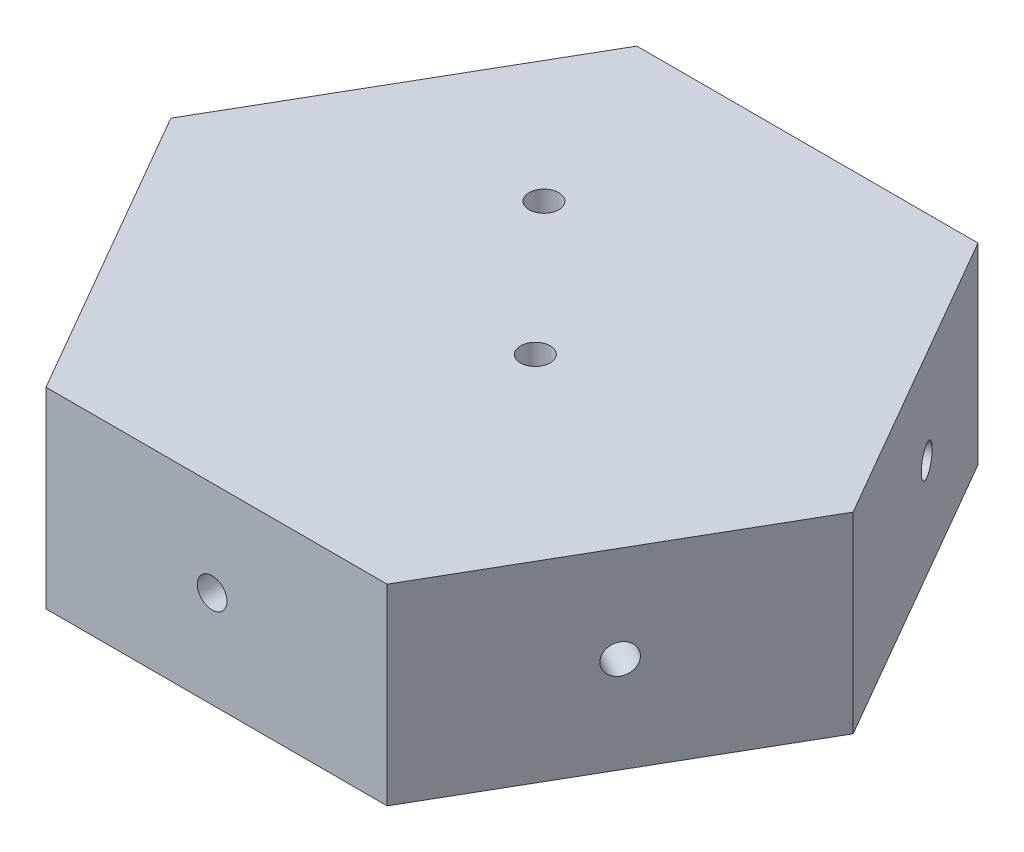
ISO-10303-21;
HEADER;
FILE_DESCRIPTION(('STEP AP214'),'2;1');
FILE_NAME('part.step','',(''),(''),'','','');
FILE_SCHEMA(('AUTOMOTIVE_DESIGN { 1 0 10303 214 1 1 1 1 }'));
ENDSEC;
DATA;
#1=APPLICATION_CONTEXT('core data for automotive mechanical design processes');
#2=APPLICATION_PROTOCOL_DEFINITION('international standard','automotive_design',2000,#1);
#3=PRODUCT_CONTEXT('',#1,'mechanical');
#4=PRODUCT('Part','Part','',(#3));
#5=PRODUCT_RELATED_PRODUCT_CATEGORY('part','',(#4));
#6=PRODUCT_DEFINITION_FORMATION('','',#4);
#7=PRODUCT_DEFINITION_CONTEXT('part definition',#1,'design');
#8=PRODUCT_DEFINITION('design','',#6,#7);
#9=PRODUCT_DEFINITION_SHAPE('','',#8);
#10=(LENGTH_UNIT() NAMED_UNIT(*) SI_UNIT(.MILLI.,.METRE.));
#11=(NAMED_UNIT(*) PLANE_ANGLE_UNIT() SI_UNIT($,.RADIAN.));
#12=(NAMED_UNIT(*) SI_UNIT($,.STERADIAN.) SOLID_ANGLE_UNIT());
#13=UNCERTAINTY_MEASURE_WITH_UNIT(LENGTH_MEASURE(1.E-05),#10,'distance_accuracy_value','');
#14=(GEOMETRIC_REPRESENTATION_CONTEXT(3) GLOBAL_UNCERTAINTY_ASSIGNED_CONTEXT((#13)) GLOBAL_UNIT_ASSIGNED_CONTEXT((#10,
#11,#12)) REPRESENTATION_CONTEXT('',''));
#15=CARTESIAN_POINT('',(0.,0.,0.));
#16=DIRECTION('',(0.,0.,1.));
#17=DIRECTION('',(1.,0.,0.));
#18=AXIS2_PLACEMENT_3D('',#15,#16,#17);
#19=CARTESIAN_POINT('',(29.3293936748329,16.51,50.8));
#20=DIRECTION('',(-0.866025403784438,0.,-0.500000000000001));
#21=DIRECTION('',(-0.500000000000001,0.,0.866025403784438));
#22=AXIS2_PLACEMENT_3D('',#19,#20,#21);
#23=PLANE('',#22);
#24=CARTESIAN_POINT('',(43.9940905122495,0.,25.4));
#25=DIRECTION('',(0.866025403784438,0.,0.500000000000001));
#26=DIRECTION('',(0.500000000000001,0.,-0.866025403784438));
#27=AXIS2_PLACEMENT_3D('',#24,#25,#26);
#28=CIRCLE('',#27,2.55269999999999);
#29=CARTESIAN_POINT('',(45.2704405122495,0.,23.1892969517595));
#30=VERTEX_POINT('',#29);
#31=EDGE_CURVE('E171',#30,#30,#28,.T.);
#32=ORIENTED_EDGE('',*,*,#31,.F.);
#33=EDGE_LOOP('',(#32));
#34=FACE_BOUND('',#33,.T.);
#35=DIRECTION('',(0.500000000000001,0.,-0.866025403784438));
#36=VECTOR('',#35,1.);
#37=CARTESIAN_POINT('',(29.3293936748329,-16.51,50.8));
#38=LINE('',#37,#36);
#39=CARTESIAN_POINT('',(29.3293936748329,-16.51,50.8));
#40=VERTEX_POINT('',#39);
#41=CARTESIAN_POINT('',(58.658787349666,-16.51,0.));
#42=VERTEX_POINT('',#41);
#43=EDGE_CURVE('E124',#40,#42,#38,.T.);
#44=ORIENTED_EDGE('',*,*,#43,.T.);
#45=DIRECTION('',(0.,-1.,0.));
#46=VECTOR('',#45,1.);
#47=CARTESIAN_POINT('',(58.658787349666,16.51,0.));
#48=LINE('',#47,#46);
#49=CARTESIAN_POINT('',(58.658787349666,16.51,0.));
#50=VERTEX_POINT('',#49);
#51=EDGE_CURVE('E11',#50,#42,#48,.T.);
#52=ORIENTED_EDGE('',*,*,#51,.F.);
#53=DIRECTION('',(0.500000000000001,0.,-0.866025403784438));
#54=VECTOR('',#53,1.);
#55=CARTESIAN_POINT('',(29.3293936748329,16.51,50.8));
#56=LINE('',#55,#54);
#57=CARTESIAN_POINT('',(29.3293936748329,16.51,50.8));
#58=VERTEX_POINT('',#57);
#59=EDGE_CURVE('E135',#58,#50,#56,.T.);
#60=ORIENTED_EDGE('',*,*,#59,.F.);
#61=DIRECTION('',(0.,-1.,0.));
#62=VECTOR('',#61,1.);
#63=CARTESIAN_POINT('',(29.3293936748329,16.51,50.8));
#64=LINE('',#63,#62);
#65=EDGE_CURVE('E120',#58,#40,#64,.T.);
#66=ORIENTED_EDGE('',*,*,#65,.T.);
#67=EDGE_LOOP('',(#44,#52,#60,#66));
#68=FACE_BOUND('',#67,.T.);
#69=ADVANCED_FACE('F37',(#34,#68),#23,.F.);
#70=CARTESIAN_POINT('',(58.658787349666,16.51,0.));
#71=DIRECTION('',(-0.866025403784439,0.,0.5));
#72=DIRECTION('',(0.5,0.,0.866025403784439));
#73=AXIS2_PLACEMENT_3D('',#70,#71,#72);
#74=PLANE('',#73);
#75=CARTESIAN_POINT('',(41.3695186698174,0.562395415575524,-29.9458917792071));
#76=DIRECTION('',(0.866025403784439,0.,-0.5));
#77=DIRECTION('',(-0.5,0.,-0.866025403784439));
#78=AXIS2_PLACEMENT_3D('',#75,#76,#77);
#79=CIRCLE('',#78,2.55269999999999);
#80=CARTESIAN_POINT('',(40.0931686698174,0.562395415575524,-32.1565948274477));
#81=VERTEX_POINT('',#80);
#82=EDGE_CURVE('E180',#81,#81,#79,.T.);
#83=ORIENTED_EDGE('',*,*,#82,.F.);
#84=EDGE_LOOP('',(#83));
#85=FACE_BOUND('',#84,.T.);
#86=DIRECTION('',(-0.5,0.,-0.866025403784439));
#87=VECTOR('',#86,1.);
#88=CARTESIAN_POINT('',(58.658787349666,-16.51,0.));
#89=LINE('',#88,#87);
#90=CARTESIAN_POINT('',(29.329393674833,-16.51,-50.8));
#91=VERTEX_POINT('',#90);
#92=EDGE_CURVE('E127',#42,#91,#89,.T.);
#93=ORIENTED_EDGE('',*,*,#92,.T.);
#94=DIRECTION('',(0.,-1.,0.));
#95=VECTOR('',#94,1.);
#96=CARTESIAN_POINT('',(29.329393674833,16.51,-50.8));
#97=LINE('',#96,#95);
#98=CARTESIAN_POINT('',(29.329393674833,16.51,-50.8));
#99=VERTEX_POINT('',#98);
#100=EDGE_CURVE('E45',#99,#91,#97,.T.);
#101=ORIENTED_EDGE('',*,*,#100,.F.);
#102=DIRECTION('',(-0.5,0.,-0.866025403784439));
#103=VECTOR('',#102,1.);
#104=CARTESIAN_POINT('',(58.658787349666,16.51,0.));
#105=LINE('',#104,#103);
#106=EDGE_CURVE('E91',#50,#99,#105,.T.);
#107=ORIENTED_EDGE('',*,*,#106,.F.);
#108=ORIENTED_EDGE('',*,*,#51,.T.);
#109=EDGE_LOOP('',(#93,#101,#107,#108));
#110=FACE_BOUND('',#109,.T.);
#111=ADVANCED_FACE('F163',(#85,#110),#74,.F.);
#112=CARTESIAN_POINT('',(29.329393674833,16.51,-50.8));
#113=DIRECTION('',(0.,0.,1.));
#114=DIRECTION('',(1.,0.,0.));
#115=AXIS2_PLACEMENT_3D('',#112,#113,#114);
#116=PLANE('',#115);
#117=CARTESIAN_POINT('',(3.49006176912397,-2.91662730810145,-50.8));
#118=DIRECTION('',(0.,0.,-1.));
#119=DIRECTION('',(-1.,0.,0.));
#120=AXIS2_PLACEMENT_3D('',#117,#118,#119);
#121=CIRCLE('',#120,2.55269999999999);
#122=CARTESIAN_POINT('',(0.937361769123982,-2.91662730810145,-50.8));
#123=VERTEX_POINT('',#122);
#124=EDGE_CURVE('E201',#123,#123,#121,.T.);
#125=ORIENTED_EDGE('',*,*,#124,.F.);
#126=EDGE_LOOP('',(#125));
#127=FACE_BOUND('',#126,.T.);
#128=DIRECTION('',(-1.,0.,0.));
#129=VECTOR('',#128,1.);
#130=CARTESIAN_POINT('',(29.329393674833,-16.51,-50.8));
#131=LINE('',#130,#129);
#132=CARTESIAN_POINT('',(-29.329393674833,-16.51,-50.8));
#133=VERTEX_POINT('',#132);
#134=EDGE_CURVE('E130',#91,#133,#131,.T.);
#135=ORIENTED_EDGE('',*,*,#134,.T.);
#136=DIRECTION('',(0.,-1.,0.));
#137=VECTOR('',#136,1.);
#138=CARTESIAN_POINT('',(-29.329393674833,16.51,-50.8));
#139=LINE('',#138,#137);
#140=CARTESIAN_POINT('',(-29.329393674833,16.51,-50.8));
#141=VERTEX_POINT('',#140);
#142=EDGE_CURVE('E115',#141,#133,#139,.T.);
#143=ORIENTED_EDGE('',*,*,#142,.F.);
#144=DIRECTION('',(-1.,0.,0.));
#145=VECTOR('',#144,1.);
#146=CARTESIAN_POINT('',(29.329393674833,16.51,-50.8));
#147=LINE('',#146,#145);
#148=EDGE_CURVE('E106',#99,#141,#147,.T.);
#149=ORIENTED_EDGE('',*,*,#148,.F.);
#150=ORIENTED_EDGE('',*,*,#100,.T.);
#151=EDGE_LOOP('',(#135,#143,#149,#150));
#152=FACE_BOUND('',#151,.T.);
#153=ADVANCED_FACE('F141',(#127,#152),#116,.F.);
#154=CARTESIAN_POINT('',(-29.329393674833,16.51,-50.8));
#155=DIRECTION('',(0.866025403784439,0.,0.5));
#156=DIRECTION('',(0.5,0.,-0.866025403784439));
#157=AXIS2_PLACEMENT_3D('',#154,#155,#156);
#158=PLANE('',#157);
#159=CARTESIAN_POINT('',(-48.0314023050068,-4.74515927134678,-18.4071708489473));
#160=DIRECTION('',(-0.866025403784439,0.,-0.5));
#161=DIRECTION('',(-0.5,0.,0.866025403784439));
#162=AXIS2_PLACEMENT_3D('',#159,#160,#161);
#163=CIRCLE('',#162,2.55269999999999);
#164=CARTESIAN_POINT('',(-49.3077523050068,-4.74515927134678,-16.1964678007068));
#165=VERTEX_POINT('',#164);
#166=EDGE_CURVE('E195',#165,#165,#163,.T.);
#167=ORIENTED_EDGE('',*,*,#166,.F.);
#168=EDGE_LOOP('',(#167));
#169=FACE_BOUND('',#168,.T.);
#170=DIRECTION('',(-0.5,0.,0.866025403784439));
#171=VECTOR('',#170,1.);
#172=CARTESIAN_POINT('',(-29.329393674833,-16.51,-50.8));
#173=LINE('',#172,#171);
#174=CARTESIAN_POINT('',(-58.658787349666,-16.51,0.));
#175=VERTEX_POINT('',#174);
#176=EDGE_CURVE('E114',#133,#175,#173,.T.);
#177=ORIENTED_EDGE('',*,*,#176,.T.);
#178=DIRECTION('',(0.,-1.,0.));
#179=VECTOR('',#178,1.);
#180=CARTESIAN_POINT('',(-58.658787349666,16.51,0.));
#181=LINE('',#180,#179);
#182=CARTESIAN_POINT('',(-58.658787349666,16.51,0.));
#183=VERTEX_POINT('',#182);
#184=EDGE_CURVE('E111',#183,#175,#181,.T.);
#185=ORIENTED_EDGE('',*,*,#184,.F.);
#186=DIRECTION('',(-0.5,0.,0.866025403784439));
#187=VECTOR('',#186,1.);
#188=CARTESIAN_POINT('',(-29.329393674833,16.51,-50.8));
#189=LINE('',#188,#187);
#190=EDGE_CURVE('E100',#141,#183,#189,.T.);
#191=ORIENTED_EDGE('',*,*,#190,.F.);
#192=ORIENTED_EDGE('',*,*,#142,.T.);
#193=EDGE_LOOP('',(#177,#185,#191,#192));
#194=FACE_BOUND('',#193,.T.);
#195=ADVANCED_FACE('F112',(#169,#194),#158,.F.);
#196=CARTESIAN_POINT('',(-58.658787349666,16.51,0.));
#197=DIRECTION('',(0.866025403784439,0.,-0.5));
#198=DIRECTION('',(-0.5,0.,-0.866025403784439));
#199=AXIS2_PLACEMENT_3D('',#196,#197,#198);
#200=PLANE('',#199);
#201=CARTESIAN_POINT('',(-38.1907027159222,-1.73066085051785,35.4517625192641));
#202=DIRECTION('',(-0.866025403784439,0.,0.5));
#203=DIRECTION('',(0.5,0.,0.866025403784439));
#204=AXIS2_PLACEMENT_3D('',#201,#202,#203);
#205=CIRCLE('',#204,2.55269999999999);
#206=CARTESIAN_POINT('',(-36.9143527159222,-1.73066085051785,37.6624655675046));
#207=VERTEX_POINT('',#206);
#208=EDGE_CURVE('E189',#207,#207,#205,.T.);
#209=ORIENTED_EDGE('',*,*,#208,.F.);
#210=EDGE_LOOP('',(#209));
#211=FACE_BOUND('',#210,.T.);
#212=DIRECTION('',(0.5,0.,0.866025403784439));
#213=VECTOR('',#212,1.);
#214=CARTESIAN_POINT('',(-58.658787349666,-16.51,0.));
#215=LINE('',#214,#213);
#216=CARTESIAN_POINT('',(-29.329393674833,-16.51,50.8));
#217=VERTEX_POINT('',#216);
#218=EDGE_CURVE('E77',#175,#217,#215,.T.);
#219=ORIENTED_EDGE('',*,*,#218,.T.);
#220=DIRECTION('',(0.,-1.,0.));
#221=VECTOR('',#220,1.);
#222=CARTESIAN_POINT('',(-29.329393674833,16.51,50.8));
#223=LINE('',#222,#221);
#224=CARTESIAN_POINT('',(-29.329393674833,16.51,50.8));
#225=VERTEX_POINT('',#224);
#226=EDGE_CURVE('E116',#225,#217,#223,.T.);
#227=ORIENTED_EDGE('',*,*,#226,.F.);
#228=DIRECTION('',(0.5,0.,0.866025403784439));
#229=VECTOR('',#228,1.);
#230=CARTESIAN_POINT('',(-58.658787349666,16.51,0.));
#231=LINE('',#230,#229);
#232=EDGE_CURVE('E104',#183,#225,#231,.T.);
#233=ORIENTED_EDGE('',*,*,#232,.F.);
#234=ORIENTED_EDGE('',*,*,#184,.T.);
#235=EDGE_LOOP('',(#219,#227,#233,#234));
#236=FACE_BOUND('',#235,.T.);
#237=ADVANCED_FACE('F118',(#211,#236),#200,.F.);
#238=CARTESIAN_POINT('',(-29.329393674833,16.51,50.8));
#239=DIRECTION('',(0.,0.,-1.));
#240=DIRECTION('',(-1.,0.,0.));
#241=AXIS2_PLACEMENT_3D('',#238,#239,#240);
#242=PLANE('',#241);
#243=CARTESIAN_POINT('',(-0.767217268227669,0.17198146021207,50.8));
#244=DIRECTION('',(0.,0.,1.));
#245=DIRECTION('',(1.,0.,0.));
#246=AXIS2_PLACEMENT_3D('',#243,#244,#245);
#247=CIRCLE('',#246,2.55269999999999);
#248=CARTESIAN_POINT('',(1.78548273177232,0.17198146021207,50.8));
#249=VERTEX_POINT('',#248);
#250=EDGE_CURVE('E177',#249,#249,#247,.T.);
#251=ORIENTED_EDGE('',*,*,#250,.F.);
#252=EDGE_LOOP('',(#251));
#253=FACE_BOUND('',#252,.T.);
#254=DIRECTION('',(1.,0.,0.));
#255=VECTOR('',#254,1.);
#256=CARTESIAN_POINT('',(-29.329393674833,-16.51,50.8));
#257=LINE('',#256,#255);
#258=EDGE_CURVE('E83',#217,#40,#257,.T.);
#259=ORIENTED_EDGE('',*,*,#258,.T.);
#260=ORIENTED_EDGE('',*,*,#65,.F.);
#261=DIRECTION('',(1.,0.,0.));
#262=VECTOR('',#261,1.);
#263=CARTESIAN_POINT('',(-29.329393674833,16.51,50.8));
#264=LINE('',#263,#262);
#265=EDGE_CURVE('E53',#225,#58,#264,.T.);
#266=ORIENTED_EDGE('',*,*,#265,.F.);
#267=ORIENTED_EDGE('',*,*,#226,.T.);
#268=EDGE_LOOP('',(#259,#260,#266,#267));
#269=FACE_BOUND('',#268,.T.);
#270=ADVANCED_FACE('F148',(#253,#269),#242,.F.);
#271=CARTESIAN_POINT('',(0.,16.51,0.));
#272=DIRECTION('',(0.,1.,0.));
#273=DIRECTION('',(0.,0.,1.));
#274=AXIS2_PLACEMENT_3D('',#271,#272,#273);
#275=PLANE('',#274);
#276=CARTESIAN_POINT('',(-14.2251630332835,16.51,-19.7173805260744));
#277=DIRECTION('',(0.,1.,0.));
#278=DIRECTION('',(0.,0.,1.));
#279=AXIS2_PLACEMENT_3D('',#276,#277,#278);
#280=CIRCLE('',#279,2.55269999999999);
#281=CARTESIAN_POINT('',(-14.2251630332835,16.51,-17.1646805260744));
#282=VERTEX_POINT('',#281);
#283=EDGE_CURVE('E425',#282,#282,#280,.T.);
#284=ORIENTED_EDGE('',*,*,#283,.F.);
#285=EDGE_LOOP('',(#284));
#286=FACE_BOUND('',#285,.T.);
#287=CARTESIAN_POINT('',(7.85448984860959,16.51,3.83965717438231));
#288=DIRECTION('',(0.,1.,0.));
#289=DIRECTION('',(0.,0.,1.));
#290=AXIS2_PLACEMENT_3D('',#287,#288,#289);
#291=CIRCLE('',#290,2.55269999999999);
#292=CARTESIAN_POINT('',(7.85448984860959,16.51,6.3923571743823));
#293=VERTEX_POINT('',#292);
#294=EDGE_CURVE('E207',#293,#293,#291,.T.);
#295=ORIENTED_EDGE('',*,*,#294,.F.);
#296=EDGE_LOOP('',(#295));
#297=FACE_BOUND('',#296,.T.);
#298=ORIENTED_EDGE('',*,*,#59,.T.);
#299=ORIENTED_EDGE('',*,*,#106,.T.);
#300=ORIENTED_EDGE('',*,*,#148,.T.);
#301=ORIENTED_EDGE('',*,*,#190,.T.);
#302=ORIENTED_EDGE('',*,*,#232,.T.);
#303=ORIENTED_EDGE('',*,*,#265,.T.);
#304=EDGE_LOOP('',(#298,#299,#300,#301,#302,#303));
#305=FACE_BOUND('',#304,.T.);
#306=ADVANCED_FACE('F102',(#286,#297,#305),#275,.T.);
#307=CARTESIAN_POINT('',(0.,-16.51,0.));
#308=DIRECTION('',(0.,1.,0.));
#309=DIRECTION('',(0.,0.,1.));
#310=AXIS2_PLACEMENT_3D('',#307,#308,#309);
#311=PLANE('',#310);
#312=ORIENTED_EDGE('',*,*,#43,.F.);
#313=ORIENTED_EDGE('',*,*,#258,.F.);
#314=ORIENTED_EDGE('',*,*,#218,.F.);
#315=ORIENTED_EDGE('',*,*,#176,.F.);
#316=ORIENTED_EDGE('',*,*,#134,.F.);
#317=ORIENTED_EDGE('',*,*,#92,.F.);
#318=EDGE_LOOP('',(#312,#313,#314,#315,#316,#317));
#319=FACE_BOUND('',#318,.T.);
#320=ADVANCED_FACE('F144',(#319),#311,.F.);
#321=CARTESIAN_POINT('',(7.85448984860959,0.,3.83965717438231));
#322=DIRECTION('',(0.,1.,0.));
#323=DIRECTION('',(0.,0.,1.));
#324=AXIS2_PLACEMENT_3D('',#321,#322,#323);
#325=CONICAL_SURFACE('',#324,2.55269999999999,1.02974425867665);
#326=CARTESIAN_POINT('',(7.85448984860958,-1.53381690219164,3.83965717438231));
#327=VERTEX_POINT('',#326);
#328=VERTEX_LOOP('',#327);
#329=FACE_BOUND('',#328,.T.);
#330=CARTESIAN_POINT('',(7.85448984860959,0.,3.83965717438231));
#331=DIRECTION('',(0.,1.,0.));
#332=DIRECTION('',(0.,0.,1.));
#333=AXIS2_PLACEMENT_3D('',#330,#331,#332);
#334=CIRCLE('',#333,2.55269999999999);
#335=CARTESIAN_POINT('',(7.85448984860959,0.,6.3923571743823));
#336=VERTEX_POINT('',#335);
#337=EDGE_CURVE('E128',#336,#336,#334,.T.);
#338=ORIENTED_EDGE('',*,*,#337,.T.);
#339=EDGE_LOOP('',(#338));
#340=FACE_BOUND('',#339,.T.);
#341=ADVANCED_FACE('F215',(#329,#340),#325,.F.);
#342=CARTESIAN_POINT('',(7.85448984860959,16.51,3.83965717438231));
#343=DIRECTION('',(0.,1.,0.));
#344=DIRECTION('',(0.,0.,1.));
#345=AXIS2_PLACEMENT_3D('',#342,#343,#344);
#346=CYLINDRICAL_SURFACE('',#345,2.55269999999999);
#347=ORIENTED_EDGE('',*,*,#337,.F.);
#348=EDGE_LOOP('',(#347));
#349=FACE_BOUND('',#348,.T.);
#350=ORIENTED_EDGE('',*,*,#294,.T.);
#351=EDGE_LOOP('',(#350));
#352=FACE_BOUND('',#351,.T.);
#353=ADVANCED_FACE('F217',(#349,#352),#346,.F.);
#354=CARTESIAN_POINT('',(3.49006176912397,-2.91662730810145,-34.29));
#355=DIRECTION('',(0.,0.,-1.));
#356=DIRECTION('',(-1.,0.,0.));
#357=AXIS2_PLACEMENT_3D('',#354,#355,#356);
#358=CONICAL_SURFACE('',#357,2.55269999999999,1.02974425867665);
#359=CARTESIAN_POINT('',(3.49006176912397,-2.91662730810145,-32.7561830978084));
#360=VERTEX_POINT('',#359);
#361=VERTEX_LOOP('',#360);
#362=FACE_BOUND('',#361,.T.);
#363=CARTESIAN_POINT('',(3.49006176912397,-2.91662730810145,-34.29));
#364=DIRECTION('',(0.,0.,-1.));
#365=DIRECTION('',(-1.,0.,0.));
#366=AXIS2_PLACEMENT_3D('',#363,#364,#365);
#367=CIRCLE('',#366,2.55269999999999);
#368=CARTESIAN_POINT('',(0.937361769123985,-2.91662730810145,-34.29));
#369=VERTEX_POINT('',#368);
#370=EDGE_CURVE('E204',#369,#369,#367,.T.);
#371=ORIENTED_EDGE('',*,*,#370,.T.);
#372=EDGE_LOOP('',(#371));
#373=FACE_BOUND('',#372,.T.);
#374=ADVANCED_FACE('F220',(#362,#373),#358,.F.);
#375=CARTESIAN_POINT('',(3.49006176912397,-2.91662730810145,-50.8));
#376=DIRECTION('',(0.,0.,-1.));
#377=DIRECTION('',(-1.,0.,0.));
#378=AXIS2_PLACEMENT_3D('',#375,#376,#377);
#379=CYLINDRICAL_SURFACE('',#378,2.55269999999999);
#380=ORIENTED_EDGE('',*,*,#370,.F.);
#381=EDGE_LOOP('',(#380));
#382=FACE_BOUND('',#381,.T.);
#383=ORIENTED_EDGE('',*,*,#124,.T.);
#384=EDGE_LOOP('',(#383));
#385=FACE_BOUND('',#384,.T.);
#386=ADVANCED_FACE('F228',(#382,#385),#379,.F.);
#387=CARTESIAN_POINT('',(-33.7333228885257,-4.74515927134678,-10.1521708489473));
#388=DIRECTION('',(-0.866025403784439,0.,-0.5));
#389=DIRECTION('',(-0.5,0.,0.866025403784439));
#390=AXIS2_PLACEMENT_3D('',#387,#388,#389);
#391=CONICAL_SURFACE('',#390,2.55269999999999,1.02974425867665);
#392=CARTESIAN_POINT('',(-32.4049984864738,-4.74515927134678,-9.38526239785146));
#393=VERTEX_POINT('',#392);
#394=VERTEX_LOOP('',#393);
#395=FACE_BOUND('',#394,.T.);
#396=CARTESIAN_POINT('',(-33.7333228885257,-4.74515927134678,-10.1521708489473));
#397=DIRECTION('',(-0.866025403784439,0.,-0.5));
#398=DIRECTION('',(-0.5,0.,0.866025403784439));
#399=AXIS2_PLACEMENT_3D('',#396,#397,#398);
#400=CIRCLE('',#399,2.55269999999999);
#401=CARTESIAN_POINT('',(-35.0096728885257,-4.74515927134678,-7.94146780070676));
#402=VERTEX_POINT('',#401);
#403=EDGE_CURVE('E198',#402,#402,#400,.T.);
#404=ORIENTED_EDGE('',*,*,#403,.T.);
#405=EDGE_LOOP('',(#404));
#406=FACE_BOUND('',#405,.T.);
#407=ADVANCED_FACE('F268',(#395,#406),#391,.F.);
#408=CARTESIAN_POINT('',(-48.0314023050068,-4.74515927134678,-18.4071708489473));
#409=DIRECTION('',(-0.866025403784439,0.,-0.5));
#410=DIRECTION('',(-0.5,0.,0.866025403784439));
#411=AXIS2_PLACEMENT_3D('',#408,#409,#410);
#412=CYLINDRICAL_SURFACE('',#411,2.55269999999999);
#413=ORIENTED_EDGE('',*,*,#403,.F.);
#414=EDGE_LOOP('',(#413));
#415=FACE_BOUND('',#414,.T.);
#416=ORIENTED_EDGE('',*,*,#166,.T.);
#417=EDGE_LOOP('',(#416));
#418=FACE_BOUND('',#417,.T.);
#419=ADVANCED_FACE('F279',(#415,#418),#412,.F.);
#420=CARTESIAN_POINT('',(-23.8926232994411,-1.73066085051785,27.1967625192641));
#421=DIRECTION('',(-0.866025403784439,0.,0.5));
#422=DIRECTION('',(0.5,0.,0.866025403784439));
#423=AXIS2_PLACEMENT_3D('',#420,#421,#422);
#424=CONICAL_SURFACE('',#423,2.55269999999999,1.02974425867665);
#425=CARTESIAN_POINT('',(-22.5642988973892,-1.73066085051786,26.4298540681683));
#426=VERTEX_POINT('',#425);
#427=VERTEX_LOOP('',#426);
#428=FACE_BOUND('',#427,.T.);
#429=CARTESIAN_POINT('',(-23.8926232994411,-1.73066085051785,27.1967625192641));
#430=DIRECTION('',(-0.866025403784439,0.,0.5));
#431=DIRECTION('',(0.5,0.,0.866025403784439));
#432=AXIS2_PLACEMENT_3D('',#429,#430,#431);
#433=CIRCLE('',#432,2.55269999999999);
#434=CARTESIAN_POINT('',(-22.6162732994411,-1.73066085051785,29.4074655675046));
#435=VERTEX_POINT('',#434);
#436=EDGE_CURVE('E192',#435,#435,#433,.T.);
#437=ORIENTED_EDGE('',*,*,#436,.T.);
#438=EDGE_LOOP('',(#437));
#439=FACE_BOUND('',#438,.T.);
#440=ADVANCED_FACE('F289',(#428,#439),#424,.F.);
#441=CARTESIAN_POINT('',(-38.1907027159222,-1.73066085051785,35.4517625192641));
#442=DIRECTION('',(-0.866025403784439,0.,0.5));
#443=DIRECTION('',(0.5,0.,0.866025403784439));
#444=AXIS2_PLACEMENT_3D('',#441,#442,#443);
#445=CYLINDRICAL_SURFACE('',#444,2.55269999999999);
#446=ORIENTED_EDGE('',*,*,#436,.F.);
#447=EDGE_LOOP('',(#446));
#448=FACE_BOUND('',#447,.T.);
#449=ORIENTED_EDGE('',*,*,#208,.T.);
#450=EDGE_LOOP('',(#449));
#451=FACE_BOUND('',#450,.T.);
#452=ADVANCED_FACE('F301',(#448,#451),#445,.F.);
#453=CARTESIAN_POINT('',(-0.767217268227669,0.17198146021207,34.29));
#454=DIRECTION('',(0.,0.,1.));
#455=DIRECTION('',(1.,0.,0.));
#456=AXIS2_PLACEMENT_3D('',#453,#454,#455);
#457=CONICAL_SURFACE('',#456,2.55269999999999,1.02974425867665);
#458=CARTESIAN_POINT('',(-0.767217268227672,0.17198146021207,32.7561830978083));
#459=VERTEX_POINT('',#458);
#460=VERTEX_LOOP('',#459);
#461=FACE_BOUND('',#460,.T.);
#462=CARTESIAN_POINT('',(-0.767217268227669,0.17198146021207,34.29));
#463=DIRECTION('',(0.,0.,1.));
#464=DIRECTION('',(1.,0.,0.));
#465=AXIS2_PLACEMENT_3D('',#462,#463,#464);
#466=CIRCLE('',#465,2.55269999999999);
#467=CARTESIAN_POINT('',(1.78548273177232,0.17198146021207,34.29));
#468=VERTEX_POINT('',#467);
#469=EDGE_CURVE('E186',#468,#468,#466,.T.);
#470=ORIENTED_EDGE('',*,*,#469,.T.);
#471=EDGE_LOOP('',(#470));
#472=FACE_BOUND('',#471,.T.);
#473=ADVANCED_FACE('F311',(#461,#472),#457,.F.);
#474=CARTESIAN_POINT('',(-0.767217268227669,0.17198146021207,50.8));
#475=DIRECTION('',(0.,0.,1.));
#476=DIRECTION('',(1.,0.,0.));
#477=AXIS2_PLACEMENT_3D('',#474,#475,#476);
#478=CYLINDRICAL_SURFACE('',#477,2.55269999999999);
#479=ORIENTED_EDGE('',*,*,#469,.F.);
#480=EDGE_LOOP('',(#479));
#481=FACE_BOUND('',#480,.T.);
#482=ORIENTED_EDGE('',*,*,#250,.T.);
#483=EDGE_LOOP('',(#482));
#484=FACE_BOUND('',#483,.T.);
#485=ADVANCED_FACE('F323',(#481,#484),#478,.F.);
#486=CARTESIAN_POINT('',(29.6960110957684,0.,17.145));
#487=DIRECTION('',(0.866025403784438,0.,0.500000000000001));
#488=DIRECTION('',(0.500000000000001,0.,-0.866025403784438));
#489=AXIS2_PLACEMENT_3D('',#486,#487,#488);
#490=CONICAL_SURFACE('',#489,2.55269999999999,1.02974425867665);
#491=CARTESIAN_POINT('',(28.3676866937165,0.,16.3780915489042));
#492=VERTEX_POINT('',#491);
#493=VERTEX_LOOP('',#492);
#494=FACE_BOUND('',#493,.T.);
#495=CARTESIAN_POINT('',(29.6960110957684,0.,17.145));
#496=DIRECTION('',(0.866025403784438,0.,0.500000000000001));
#497=DIRECTION('',(0.500000000000001,0.,-0.866025403784438));
#498=AXIS2_PLACEMENT_3D('',#495,#496,#497);
#499=CIRCLE('',#498,2.55269999999999);
#500=CARTESIAN_POINT('',(30.9723610957684,0.,14.9342969517595));
#501=VERTEX_POINT('',#500);
#502=EDGE_CURVE('E173',#501,#501,#499,.T.);
#503=ORIENTED_EDGE('',*,*,#502,.T.);
#504=EDGE_LOOP('',(#503));
#505=FACE_BOUND('',#504,.T.);
#506=ADVANCED_FACE('F333',(#494,#505),#490,.F.);
#507=CARTESIAN_POINT('',(43.9940905122495,0.,25.4));
#508=DIRECTION('',(0.866025403784438,0.,0.500000000000001));
#509=DIRECTION('',(0.500000000000001,0.,-0.866025403784438));
#510=AXIS2_PLACEMENT_3D('',#507,#508,#509);
#511=CYLINDRICAL_SURFACE('',#510,2.55269999999999);
#512=ORIENTED_EDGE('',*,*,#502,.F.);
#513=EDGE_LOOP('',(#512));
#514=FACE_BOUND('',#513,.T.);
#515=ORIENTED_EDGE('',*,*,#31,.T.);
#516=EDGE_LOOP('',(#515));
#517=FACE_BOUND('',#516,.T.);
#518=ADVANCED_FACE('F345',(#514,#517),#511,.F.);
#519=CARTESIAN_POINT('',(27.0714392533363,0.562395415575524,-21.6908917792071));
#520=DIRECTION('',(0.866025403784439,0.,-0.5));
#521=DIRECTION('',(-0.5,0.,-0.866025403784439));
#522=AXIS2_PLACEMENT_3D('',#519,#520,#521);
#523=CONICAL_SURFACE('',#522,2.55269999999999,1.02974425867665);
#524=CARTESIAN_POINT('',(25.7431148512844,0.562395415575521,-20.9239833281113));
#525=VERTEX_POINT('',#524);
#526=VERTEX_LOOP('',#525);
#527=FACE_BOUND('',#526,.T.);
#528=CARTESIAN_POINT('',(27.0714392533363,0.562395415575524,-21.6908917792071));
#529=DIRECTION('',(0.866025403784439,0.,-0.5));
#530=DIRECTION('',(-0.5,0.,-0.866025403784439));
#531=AXIS2_PLACEMENT_3D('',#528,#529,#530);
#532=CIRCLE('',#531,2.55269999999999);
#533=CARTESIAN_POINT('',(25.7950892533363,0.562395415575524,-23.9015948274477));
#534=VERTEX_POINT('',#533);
#535=EDGE_CURVE('E174',#534,#534,#532,.T.);
#536=ORIENTED_EDGE('',*,*,#535,.T.);
#537=EDGE_LOOP('',(#536));
#538=FACE_BOUND('',#537,.T.);
#539=ADVANCED_FACE('F355',(#527,#538),#523,.F.);
#540=CARTESIAN_POINT('',(41.3695186698174,0.562395415575524,-29.9458917792071));
#541=DIRECTION('',(0.866025403784439,0.,-0.5));
#542=DIRECTION('',(-0.5,0.,-0.866025403784439));
#543=AXIS2_PLACEMENT_3D('',#540,#541,#542);
#544=CYLINDRICAL_SURFACE('',#543,2.55269999999999);
#545=ORIENTED_EDGE('',*,*,#535,.F.);
#546=EDGE_LOOP('',(#545));
#547=FACE_BOUND('',#546,.T.);
#548=ORIENTED_EDGE('',*,*,#82,.T.);
#549=EDGE_LOOP('',(#548));
#550=FACE_BOUND('',#549,.T.);
#551=ADVANCED_FACE('F367',(#547,#550),#544,.F.);
#552=CARTESIAN_POINT('',(-14.2251630332835,0.,-19.7173805260744));
#553=DIRECTION('',(0.,1.,0.));
#554=DIRECTION('',(0.,0.,1.));
#555=AXIS2_PLACEMENT_3D('',#552,#553,#554);
#556=CONICAL_SURFACE('',#555,2.55269999999999,1.02974425867665);
#557=CARTESIAN_POINT('',(-14.2251630332835,-1.53381690219164,-19.7173805260744));
#558=VERTEX_POINT('',#557);
#559=VERTEX_LOOP('',#558);
#560=FACE_BOUND('',#559,.T.);
#561=CARTESIAN_POINT('',(-14.2251630332835,0.,-19.7173805260744));
#562=DIRECTION('',(0.,1.,0.));
#563=DIRECTION('',(0.,0.,1.));
#564=AXIS2_PLACEMENT_3D('',#561,#562,#563);
#565=CIRCLE('',#564,2.55269999999999);
#566=CARTESIAN_POINT('',(-14.2251630332835,0.,-17.1646805260744));
#567=VERTEX_POINT('',#566);
#568=EDGE_CURVE('E422',#567,#567,#565,.T.);
#569=ORIENTED_EDGE('',*,*,#568,.T.);
#570=EDGE_LOOP('',(#569));
#571=FACE_BOUND('',#570,.T.);
#572=ADVANCED_FACE('F377',(#560,#571),#556,.F.);
#573=CARTESIAN_POINT('',(-14.2251630332835,16.51,-19.7173805260744));
#574=DIRECTION('',(0.,1.,0.));
#575=DIRECTION('',(0.,0.,1.));
#576=AXIS2_PLACEMENT_3D('',#573,#574,#575);
#577=CYLINDRICAL_SURFACE('',#576,2.55269999999999);
#578=ORIENTED_EDGE('',*,*,#568,.F.);
#579=EDGE_LOOP('',(#578));
#580=FACE_BOUND('',#579,.T.);
#581=ORIENTED_EDGE('',*,*,#283,.T.);
#582=EDGE_LOOP('',(#581));
#583=FACE_BOUND('',#582,.T.);
#584=ADVANCED_FACE('F389',(#580,#583),#577,.F.);
#585=CLOSED_SHELL('',(#69,#111,#153,#195,#237,#270,#306,#320,#341,#353,#374,#386,#407,#419,#440,
#452,#473,#485,#506,#518,#539,#551,#572,#584));
#586=MANIFOLD_SOLID_BREP('B2',#585);
#587=ADVANCED_BREP_SHAPE_REPRESENTATION('',(#18,#586),#14);
#588=SHAPE_DEFINITION_REPRESENTATION(#9,#587);
ENDSEC;
END-ISO-10303-21;
